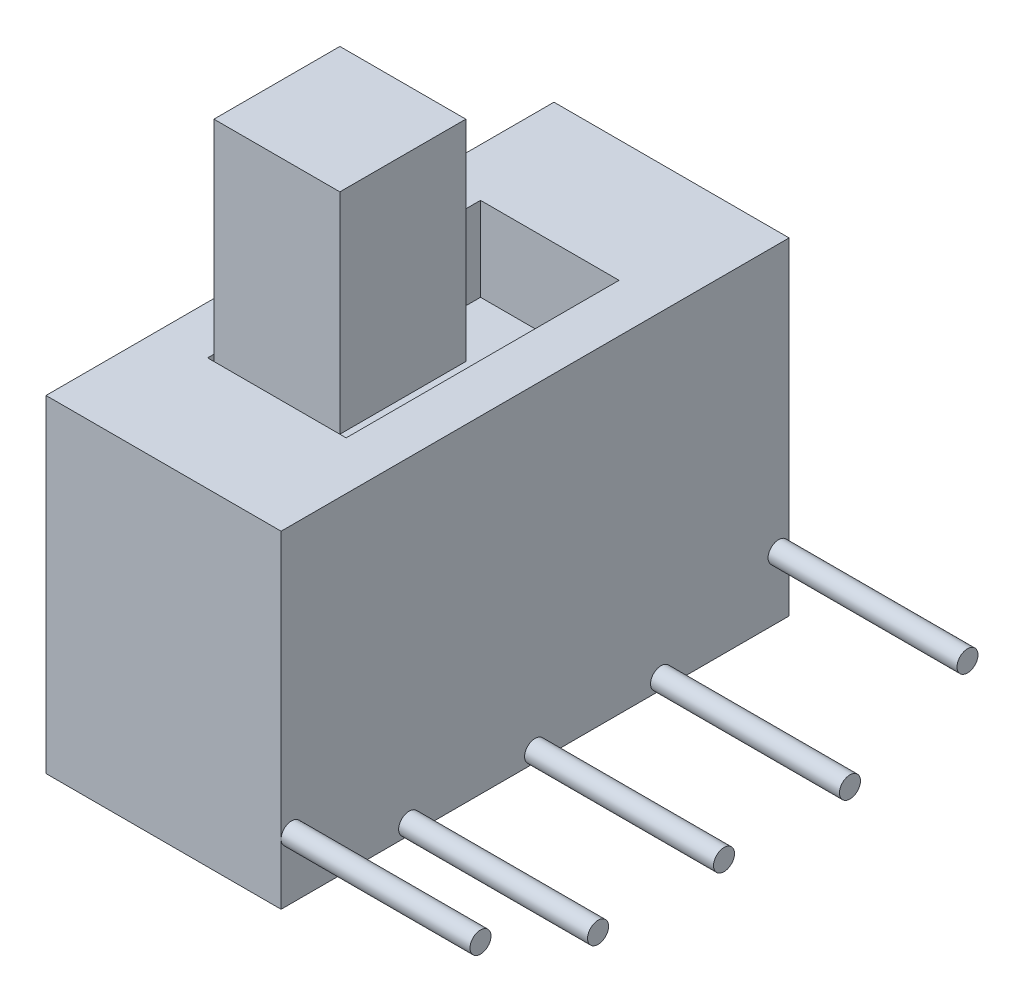
ISO-10303-21;
HEADER;
FILE_DESCRIPTION(('STEP AP214'),'2;1');
FILE_NAME('part.step','',(''),(''),'','','');
FILE_SCHEMA(('AUTOMOTIVE_DESIGN { 1 0 10303 214 1 1 1 1 }'));
ENDSEC;
DATA;
#1=APPLICATION_CONTEXT('core data for automotive mechanical design processes');
#2=APPLICATION_PROTOCOL_DEFINITION('international standard','automotive_design',2000,#1);
#3=PRODUCT_CONTEXT('',#1,'mechanical');
#4=PRODUCT('Part','Part','',(#3));
#5=PRODUCT_RELATED_PRODUCT_CATEGORY('part','',(#4));
#6=PRODUCT_DEFINITION_FORMATION('','',#4);
#7=PRODUCT_DEFINITION_CONTEXT('part definition',#1,'design');
#8=PRODUCT_DEFINITION('design','',#6,#7);
#9=PRODUCT_DEFINITION_SHAPE('','',#8);
#10=(LENGTH_UNIT() NAMED_UNIT(*) SI_UNIT(.MILLI.,.METRE.));
#11=(NAMED_UNIT(*) PLANE_ANGLE_UNIT() SI_UNIT($,.RADIAN.));
#12=(NAMED_UNIT(*) SI_UNIT($,.STERADIAN.) SOLID_ANGLE_UNIT());
#13=UNCERTAINTY_MEASURE_WITH_UNIT(LENGTH_MEASURE(1.E-05),#10,'distance_accuracy_value','');
#14=(GEOMETRIC_REPRESENTATION_CONTEXT(3) GLOBAL_UNCERTAINTY_ASSIGNED_CONTEXT((#13)) GLOBAL_UNIT_ASSIGNED_CONTEXT((#10,
#11,#12)) REPRESENTATION_CONTEXT('',''));
#15=CARTESIAN_POINT('',(0.,0.,0.));
#16=DIRECTION('',(0.,0.,1.));
#17=DIRECTION('',(1.,0.,0.));
#18=AXIS2_PLACEMENT_3D('',#15,#16,#17);
#19=CARTESIAN_POINT('',(2.80000000000001,7.8,-6.05000000000001));
#20=DIRECTION('',(-1.,0.,0.));
#21=DIRECTION('',(0.,0.,1.));
#22=AXIS2_PLACEMENT_3D('',#19,#20,#21);
#23=PLANE('',#22);
#24=DIRECTION('',(0.,-1.,0.));
#25=VECTOR('',#24,1.);
#26=CARTESIAN_POINT('',(2.80000000000001,7.8,6.04999999999999));
#27=LINE('',#26,#25);
#28=CARTESIAN_POINT('',(2.80000000000001,7.8,6.04999999999999));
#29=VERTEX_POINT('',#28);
#30=CARTESIAN_POINT('',(2.80000000000001,1.45,6.04999999999999));
#31=VERTEX_POINT('',#30);
#32=EDGE_CURVE('E298',#29,#31,#27,.T.);
#33=ORIENTED_EDGE('',*,*,#32,.T.);
#34=CARTESIAN_POINT('',(2.80000000000001,1.45,5.8));
#35=DIRECTION('',(1.,0.,0.));
#36=DIRECTION('',(0.,0.,1.));
#37=AXIS2_PLACEMENT_3D('',#34,#35,#36);
#38=CIRCLE('',#37,0.25);
#39=EDGE_CURVE('E193',#31,#31,#38,.T.);
#40=ORIENTED_EDGE('',*,*,#39,.F.);
#41=CARTESIAN_POINT('',(2.80000000000001,0.,6.04999999999999));
#42=VERTEX_POINT('',#41);
#43=EDGE_CURVE('E166',#31,#42,#27,.T.);
#44=ORIENTED_EDGE('',*,*,#43,.T.);
#45=DIRECTION('',(0.,0.,-1.));
#46=VECTOR('',#45,1.);
#47=CARTESIAN_POINT('',(2.80000000000001,0.,-6.05000000000001));
#48=LINE('',#47,#46);
#49=CARTESIAN_POINT('',(2.80000000000001,0.,3.));
#50=VERTEX_POINT('',#49);
#51=EDGE_CURVE('E160',#42,#50,#48,.T.);
#52=ORIENTED_EDGE('',*,*,#51,.T.);
#53=CARTESIAN_POINT('',(2.80000000000001,0.25,3.));
#54=DIRECTION('',(1.,0.,0.));
#55=DIRECTION('',(0.,0.,-1.));
#56=AXIS2_PLACEMENT_3D('',#53,#54,#55);
#57=CIRCLE('',#56,0.25);
#58=EDGE_CURVE('E174',#50,#50,#57,.T.);
#59=ORIENTED_EDGE('',*,*,#58,.F.);
#60=CARTESIAN_POINT('',(2.80000000000001,0.,0.));
#61=VERTEX_POINT('',#60);
#62=EDGE_CURVE('E165',#50,#61,#48,.T.);
#63=ORIENTED_EDGE('',*,*,#62,.T.);
#64=CARTESIAN_POINT('',(2.80000000000001,0.25,0.));
#65=DIRECTION('',(1.,0.,0.));
#66=DIRECTION('',(0.,0.,-1.));
#67=AXIS2_PLACEMENT_3D('',#64,#65,#66);
#68=CIRCLE('',#67,0.25);
#69=EDGE_CURVE('E173',#61,#61,#68,.T.);
#70=ORIENTED_EDGE('',*,*,#69,.F.);
#71=CARTESIAN_POINT('',(2.80000000000001,0.,-3.));
#72=VERTEX_POINT('',#71);
#73=EDGE_CURVE('E158',#61,#72,#48,.T.);
#74=ORIENTED_EDGE('',*,*,#73,.T.);
#75=CARTESIAN_POINT('',(2.80000000000001,0.25,-3.));
#76=DIRECTION('',(1.,0.,0.));
#77=DIRECTION('',(0.,0.,1.));
#78=AXIS2_PLACEMENT_3D('',#75,#76,#77);
#79=CIRCLE('',#78,0.25);
#80=EDGE_CURVE('E181',#72,#72,#79,.T.);
#81=ORIENTED_EDGE('',*,*,#80,.F.);
#82=CARTESIAN_POINT('',(2.80000000000001,0.,-6.05000000000001));
#83=VERTEX_POINT('',#82);
#84=EDGE_CURVE('E154',#72,#83,#48,.T.);
#85=ORIENTED_EDGE('',*,*,#84,.T.);
#86=DIRECTION('',(0.,-1.,0.));
#87=VECTOR('',#86,1.);
#88=CARTESIAN_POINT('',(2.80000000000001,7.8,-6.05000000000001));
#89=LINE('',#88,#87);
#90=CARTESIAN_POINT('',(2.80000000000001,1.45,-6.05000000000001));
#91=VERTEX_POINT('',#90);
#92=EDGE_CURVE('E177',#91,#83,#89,.T.);
#93=ORIENTED_EDGE('',*,*,#92,.F.);
#94=CARTESIAN_POINT('',(2.80000000000001,1.45,-5.8));
#95=DIRECTION('',(1.,0.,0.));
#96=DIRECTION('',(0.,0.,-1.));
#97=AXIS2_PLACEMENT_3D('',#94,#95,#96);
#98=CIRCLE('',#97,0.25);
#99=EDGE_CURVE('E187',#91,#91,#98,.T.);
#100=ORIENTED_EDGE('',*,*,#99,.F.);
#101=CARTESIAN_POINT('',(2.80000000000001,7.8,-6.05000000000001));
#102=VERTEX_POINT('',#101);
#103=EDGE_CURVE('E163',#102,#91,#89,.T.);
#104=ORIENTED_EDGE('',*,*,#103,.F.);
#105=DIRECTION('',(0.,0.,-1.));
#106=VECTOR('',#105,1.);
#107=CARTESIAN_POINT('',(2.80000000000001,7.8,-6.05000000000001));
#108=LINE('',#107,#106);
#109=EDGE_CURVE('E135',#29,#102,#108,.T.);
#110=ORIENTED_EDGE('',*,*,#109,.F.);
#111=EDGE_LOOP('',(#33,#40,#44,#52,#59,#63,#70,#74,#81,#85,#93,#100,#104,#110));
#112=FACE_BOUND('',#111,.T.);
#113=ADVANCED_FACE('F40',(#112),#23,.F.);
#114=CARTESIAN_POINT('',(-2.79999999999999,7.8,6.04999999999999));
#115=DIRECTION('',(0.,1.,0.));
#116=DIRECTION('',(0.,0.,1.));
#117=AXIS2_PLACEMENT_3D('',#114,#115,#116);
#118=PLANE('',#117);
#119=DIRECTION('',(0.,0.,-1.));
#120=VECTOR('',#119,1.);
#121=CARTESIAN_POINT('',(1.65,7.8,-3.15));
#122=LINE('',#121,#120);
#123=CARTESIAN_POINT('',(1.65,7.8,3.35));
#124=VERTEX_POINT('',#123);
#125=CARTESIAN_POINT('',(1.65,7.8,-3.15));
#126=VERTEX_POINT('',#125);
#127=EDGE_CURVE('E44',#124,#126,#122,.T.);
#128=ORIENTED_EDGE('',*,*,#127,.F.);
#129=DIRECTION('',(1.,0.,0.));
#130=VECTOR('',#129,1.);
#131=CARTESIAN_POINT('',(1.65,7.8,3.35));
#132=LINE('',#131,#130);
#133=CARTESIAN_POINT('',(-1.65,7.8,3.35));
#134=VERTEX_POINT('',#133);
#135=EDGE_CURVE('E207',#134,#124,#132,.T.);
#136=ORIENTED_EDGE('',*,*,#135,.F.);
#137=DIRECTION('',(0.,0.,1.));
#138=VECTOR('',#137,1.);
#139=CARTESIAN_POINT('',(-1.65,7.8,-3.15));
#140=LINE('',#139,#138);
#141=CARTESIAN_POINT('',(-1.65,7.8,-3.15));
#142=VERTEX_POINT('',#141);
#143=EDGE_CURVE('E205',#142,#134,#140,.T.);
#144=ORIENTED_EDGE('',*,*,#143,.F.);
#145=DIRECTION('',(-1.,0.,0.));
#146=VECTOR('',#145,1.);
#147=CARTESIAN_POINT('',(1.65,7.8,-3.15));
#148=LINE('',#147,#146);
#149=EDGE_CURVE('E203',#126,#142,#148,.T.);
#150=ORIENTED_EDGE('',*,*,#149,.F.);
#151=EDGE_LOOP('',(#128,#136,#144,#150));
#152=FACE_BOUND('',#151,.T.);
#153=DIRECTION('',(0.,0.,1.));
#154=VECTOR('',#153,1.);
#155=CARTESIAN_POINT('',(-2.79999999999999,7.8,-6.05000000000001));
#156=LINE('',#155,#154);
#157=CARTESIAN_POINT('',(-2.79999999999999,7.8,-6.05000000000001));
#158=VERTEX_POINT('',#157);
#159=CARTESIAN_POINT('',(-2.79999999999999,7.8,6.04999999999999));
#160=VERTEX_POINT('',#159);
#161=EDGE_CURVE('E132',#158,#160,#156,.T.);
#162=ORIENTED_EDGE('',*,*,#161,.T.);
#163=DIRECTION('',(1.,0.,0.));
#164=VECTOR('',#163,1.);
#165=CARTESIAN_POINT('',(-2.79999999999999,7.8,6.04999999999999));
#166=LINE('',#165,#164);
#167=EDGE_CURVE('E153',#160,#29,#166,.T.);
#168=ORIENTED_EDGE('',*,*,#167,.T.);
#169=ORIENTED_EDGE('',*,*,#109,.T.);
#170=DIRECTION('',(-1.,0.,0.));
#171=VECTOR('',#170,1.);
#172=CARTESIAN_POINT('',(-2.79999999999999,7.8,-6.05000000000001));
#173=LINE('',#172,#171);
#174=EDGE_CURVE('E128',#102,#158,#173,.T.);
#175=ORIENTED_EDGE('',*,*,#174,.T.);
#176=EDGE_LOOP('',(#162,#168,#169,#175));
#177=FACE_BOUND('',#176,.T.);
#178=ADVANCED_FACE('F130',(#152,#177),#118,.T.);
#179=CARTESIAN_POINT('',(-2.79999999999999,7.8,-6.05000000000001));
#180=DIRECTION('',(1.,0.,0.));
#181=DIRECTION('',(0.,0.,-1.));
#182=AXIS2_PLACEMENT_3D('',#179,#180,#181);
#183=PLANE('',#182);
#184=DIRECTION('',(0.,0.,1.));
#185=VECTOR('',#184,1.);
#186=CARTESIAN_POINT('',(-2.79999999999999,0.,-6.05000000000001));
#187=LINE('',#186,#185);
#188=CARTESIAN_POINT('',(-2.79999999999999,0.,-6.05000000000001));
#189=VERTEX_POINT('',#188);
#190=CARTESIAN_POINT('',(-2.79999999999999,0.,6.04999999999999));
#191=VERTEX_POINT('',#190);
#192=EDGE_CURVE('E138',#189,#191,#187,.T.);
#193=ORIENTED_EDGE('',*,*,#192,.T.);
#194=DIRECTION('',(0.,-1.,0.));
#195=VECTOR('',#194,1.);
#196=CARTESIAN_POINT('',(-2.79999999999999,7.8,6.04999999999999));
#197=LINE('',#196,#195);
#198=EDGE_CURVE('E152',#160,#191,#197,.T.);
#199=ORIENTED_EDGE('',*,*,#198,.F.);
#200=ORIENTED_EDGE('',*,*,#161,.F.);
#201=DIRECTION('',(0.,-1.,0.));
#202=VECTOR('',#201,1.);
#203=CARTESIAN_POINT('',(-2.79999999999999,7.8,-6.05000000000001));
#204=LINE('',#203,#202);
#205=EDGE_CURVE('E141',#158,#189,#204,.T.);
#206=ORIENTED_EDGE('',*,*,#205,.T.);
#207=EDGE_LOOP('',(#193,#199,#200,#206));
#208=FACE_BOUND('',#207,.T.);
#209=ADVANCED_FACE('F150',(#208),#183,.F.);
#210=CARTESIAN_POINT('',(-2.79999999999999,7.8,6.04999999999999));
#211=DIRECTION('',(0.,0.,-1.));
#212=DIRECTION('',(-1.,0.,0.));
#213=AXIS2_PLACEMENT_3D('',#210,#211,#212);
#214=PLANE('',#213);
#215=DIRECTION('',(1.,0.,0.));
#216=VECTOR('',#215,1.);
#217=CARTESIAN_POINT('',(-2.79999999999999,0.,6.04999999999999));
#218=LINE('',#217,#216);
#219=EDGE_CURVE('E148',#191,#42,#218,.T.);
#220=ORIENTED_EDGE('',*,*,#219,.T.);
#221=ORIENTED_EDGE('',*,*,#43,.F.);
#222=ORIENTED_EDGE('',*,*,#32,.F.);
#223=ORIENTED_EDGE('',*,*,#167,.F.);
#224=ORIENTED_EDGE('',*,*,#198,.T.);
#225=EDGE_LOOP('',(#220,#221,#222,#223,#224));
#226=FACE_BOUND('',#225,.T.);
#227=ADVANCED_FACE('F249',(#226),#214,.F.);
#228=CARTESIAN_POINT('',(-2.79999999999999,7.8,-6.05000000000001));
#229=DIRECTION('',(0.,0.,1.));
#230=DIRECTION('',(1.,0.,0.));
#231=AXIS2_PLACEMENT_3D('',#228,#229,#230);
#232=PLANE('',#231);
#233=DIRECTION('',(-1.,0.,0.));
#234=VECTOR('',#233,1.);
#235=CARTESIAN_POINT('',(-2.79999999999999,0.,-6.05000000000001));
#236=LINE('',#235,#234);
#237=EDGE_CURVE('E144',#83,#189,#236,.T.);
#238=ORIENTED_EDGE('',*,*,#237,.T.);
#239=ORIENTED_EDGE('',*,*,#205,.F.);
#240=ORIENTED_EDGE('',*,*,#174,.F.);
#241=ORIENTED_EDGE('',*,*,#103,.T.);
#242=ORIENTED_EDGE('',*,*,#92,.T.);
#243=EDGE_LOOP('',(#238,#239,#240,#241,#242));
#244=FACE_BOUND('',#243,.T.);
#245=ADVANCED_FACE('F142',(#244),#232,.F.);
#246=CARTESIAN_POINT('',(-2.79999999999999,0.,6.04999999999999));
#247=DIRECTION('',(0.,1.,0.));
#248=DIRECTION('',(0.,0.,1.));
#249=AXIS2_PLACEMENT_3D('',#246,#247,#248);
#250=PLANE('',#249);
#251=ORIENTED_EDGE('',*,*,#192,.F.);
#252=ORIENTED_EDGE('',*,*,#237,.F.);
#253=ORIENTED_EDGE('',*,*,#84,.F.);
#254=ORIENTED_EDGE('',*,*,#73,.F.);
#255=ORIENTED_EDGE('',*,*,#62,.F.);
#256=ORIENTED_EDGE('',*,*,#51,.F.);
#257=ORIENTED_EDGE('',*,*,#219,.F.);
#258=EDGE_LOOP('',(#251,#252,#253,#254,#255,#256,#257));
#259=FACE_BOUND('',#258,.T.);
#260=ADVANCED_FACE('F252',(#259),#250,.F.);
#261=CARTESIAN_POINT('',(7.30000000000001,0.25,3.));
#262=DIRECTION('',(-1.,0.,0.));
#263=DIRECTION('',(0.,0.,1.));
#264=AXIS2_PLACEMENT_3D('',#261,#262,#263);
#265=CYLINDRICAL_SURFACE('',#264,0.25);
#266=CARTESIAN_POINT('',(7.30000000000001,0.25,3.));
#267=DIRECTION('',(1.,0.,0.));
#268=DIRECTION('',(0.,0.,-1.));
#269=AXIS2_PLACEMENT_3D('',#266,#267,#268);
#270=CIRCLE('',#269,0.25);
#271=CARTESIAN_POINT('',(7.30000000000001,0.25,2.75));
#272=VERTEX_POINT('',#271);
#273=EDGE_CURVE('E170',#272,#272,#270,.T.);
#274=ORIENTED_EDGE('',*,*,#273,.F.);
#275=EDGE_LOOP('',(#274));
#276=FACE_BOUND('',#275,.T.);
#277=ORIENTED_EDGE('',*,*,#58,.T.);
#278=EDGE_LOOP('',(#277));
#279=FACE_BOUND('',#278,.T.);
#280=ADVANCED_FACE('F256',(#276,#279),#265,.T.);
#281=CARTESIAN_POINT('',(7.30000000000001,0.25,3.));
#282=DIRECTION('',(1.,0.,0.));
#283=DIRECTION('',(0.,0.,-1.));
#284=AXIS2_PLACEMENT_3D('',#281,#282,#283);
#285=PLANE('',#284);
#286=ORIENTED_EDGE('',*,*,#273,.T.);
#287=EDGE_LOOP('',(#286));
#288=FACE_BOUND('',#287,.T.);
#289=ADVANCED_FACE('F260',(#288),#285,.T.);
#290=CARTESIAN_POINT('',(7.30000000000001,0.25,0.));
#291=DIRECTION('',(-1.,0.,0.));
#292=DIRECTION('',(0.,0.,1.));
#293=AXIS2_PLACEMENT_3D('',#290,#291,#292);
#294=CYLINDRICAL_SURFACE('',#293,0.25);
#295=CARTESIAN_POINT('',(7.30000000000001,0.25,0.));
#296=DIRECTION('',(1.,0.,0.));
#297=DIRECTION('',(0.,0.,-1.));
#298=AXIS2_PLACEMENT_3D('',#295,#296,#297);
#299=CIRCLE('',#298,0.25);
#300=CARTESIAN_POINT('',(7.30000000000001,0.25,-0.250000000000003));
#301=VERTEX_POINT('',#300);
#302=EDGE_CURVE('E178',#301,#301,#299,.T.);
#303=ORIENTED_EDGE('',*,*,#302,.F.);
#304=EDGE_LOOP('',(#303));
#305=FACE_BOUND('',#304,.T.);
#306=ORIENTED_EDGE('',*,*,#69,.T.);
#307=EDGE_LOOP('',(#306));
#308=FACE_BOUND('',#307,.T.);
#309=ADVANCED_FACE('F264',(#305,#308),#294,.T.);
#310=CARTESIAN_POINT('',(7.30000000000001,0.25,0.));
#311=DIRECTION('',(1.,0.,0.));
#312=DIRECTION('',(0.,0.,-1.));
#313=AXIS2_PLACEMENT_3D('',#310,#311,#312);
#314=PLANE('',#313);
#315=ORIENTED_EDGE('',*,*,#302,.T.);
#316=EDGE_LOOP('',(#315));
#317=FACE_BOUND('',#316,.T.);
#318=ADVANCED_FACE('F268',(#317),#314,.T.);
#319=CARTESIAN_POINT('',(7.30000000000001,0.25,-3.));
#320=DIRECTION('',(-1.,0.,0.));
#321=DIRECTION('',(0.,0.,1.));
#322=AXIS2_PLACEMENT_3D('',#319,#320,#321);
#323=CYLINDRICAL_SURFACE('',#322,0.25);
#324=CARTESIAN_POINT('',(7.30000000000001,0.25,-3.));
#325=DIRECTION('',(1.,0.,0.));
#326=DIRECTION('',(0.,0.,1.));
#327=AXIS2_PLACEMENT_3D('',#324,#325,#326);
#328=CIRCLE('',#327,0.25);
#329=CARTESIAN_POINT('',(7.30000000000001,0.25,-2.75));
#330=VERTEX_POINT('',#329);
#331=EDGE_CURVE('E184',#330,#330,#328,.T.);
#332=ORIENTED_EDGE('',*,*,#331,.F.);
#333=EDGE_LOOP('',(#332));
#334=FACE_BOUND('',#333,.T.);
#335=ORIENTED_EDGE('',*,*,#80,.T.);
#336=EDGE_LOOP('',(#335));
#337=FACE_BOUND('',#336,.T.);
#338=ADVANCED_FACE('F272',(#334,#337),#323,.T.);
#339=CARTESIAN_POINT('',(7.30000000000001,0.25,-3.));
#340=DIRECTION('',(-1.,0.,0.));
#341=DIRECTION('',(0.,0.,1.));
#342=AXIS2_PLACEMENT_3D('',#339,#340,#341);
#343=PLANE('',#342);
#344=ORIENTED_EDGE('',*,*,#331,.T.);
#345=EDGE_LOOP('',(#344));
#346=FACE_BOUND('',#345,.T.);
#347=ADVANCED_FACE('F276',(#346),#343,.F.);
#348=CARTESIAN_POINT('',(7.30000000000001,1.45,-5.8));
#349=DIRECTION('',(-1.,0.,0.));
#350=DIRECTION('',(0.,0.,1.));
#351=AXIS2_PLACEMENT_3D('',#348,#349,#350);
#352=CYLINDRICAL_SURFACE('',#351,0.25);
#353=CARTESIAN_POINT('',(7.30000000000001,1.45,-5.8));
#354=DIRECTION('',(1.,0.,0.));
#355=DIRECTION('',(0.,0.,-1.));
#356=AXIS2_PLACEMENT_3D('',#353,#354,#355);
#357=CIRCLE('',#356,0.25);
#358=CARTESIAN_POINT('',(7.30000000000001,1.45,-6.05));
#359=VERTEX_POINT('',#358);
#360=EDGE_CURVE('E190',#359,#359,#357,.T.);
#361=ORIENTED_EDGE('',*,*,#360,.F.);
#362=EDGE_LOOP('',(#361));
#363=FACE_BOUND('',#362,.T.);
#364=ORIENTED_EDGE('',*,*,#99,.T.);
#365=EDGE_LOOP('',(#364));
#366=FACE_BOUND('',#365,.T.);
#367=ADVANCED_FACE('F280',(#363,#366),#352,.T.);
#368=CARTESIAN_POINT('',(7.30000000000001,1.45,-5.8));
#369=DIRECTION('',(1.,0.,0.));
#370=DIRECTION('',(0.,0.,-1.));
#371=AXIS2_PLACEMENT_3D('',#368,#369,#370);
#372=PLANE('',#371);
#373=ORIENTED_EDGE('',*,*,#360,.T.);
#374=EDGE_LOOP('',(#373));
#375=FACE_BOUND('',#374,.T.);
#376=ADVANCED_FACE('F284',(#375),#372,.T.);
#377=CARTESIAN_POINT('',(7.30000000000001,1.45,5.8));
#378=DIRECTION('',(-1.,0.,0.));
#379=DIRECTION('',(0.,0.,1.));
#380=AXIS2_PLACEMENT_3D('',#377,#378,#379);
#381=CYLINDRICAL_SURFACE('',#380,0.25);
#382=CARTESIAN_POINT('',(7.30000000000001,1.45,5.8));
#383=DIRECTION('',(1.,0.,0.));
#384=DIRECTION('',(0.,0.,1.));
#385=AXIS2_PLACEMENT_3D('',#382,#383,#384);
#386=CIRCLE('',#385,0.25);
#387=CARTESIAN_POINT('',(7.30000000000001,1.45,6.05));
#388=VERTEX_POINT('',#387);
#389=EDGE_CURVE('E196',#388,#388,#386,.T.);
#390=ORIENTED_EDGE('',*,*,#389,.F.);
#391=EDGE_LOOP('',(#390));
#392=FACE_BOUND('',#391,.T.);
#393=ORIENTED_EDGE('',*,*,#39,.T.);
#394=EDGE_LOOP('',(#393));
#395=FACE_BOUND('',#394,.T.);
#396=ADVANCED_FACE('F236',(#392,#395),#381,.T.);
#397=CARTESIAN_POINT('',(7.30000000000001,1.45,5.8));
#398=DIRECTION('',(-1.,0.,0.));
#399=DIRECTION('',(0.,0.,1.));
#400=AXIS2_PLACEMENT_3D('',#397,#398,#399);
#401=PLANE('',#400);
#402=ORIENTED_EDGE('',*,*,#389,.T.);
#403=EDGE_LOOP('',(#402));
#404=FACE_BOUND('',#403,.T.);
#405=ADVANCED_FACE('F230',(#404),#401,.F.);
#406=CARTESIAN_POINT('',(1.65,5.8,-3.15));
#407=DIRECTION('',(1.,0.,0.));
#408=DIRECTION('',(0.,0.,-1.));
#409=AXIS2_PLACEMENT_3D('',#406,#407,#408);
#410=PLANE('',#409);
#411=ORIENTED_EDGE('',*,*,#127,.T.);
#412=DIRECTION('',(0.,1.,0.));
#413=VECTOR('',#412,1.);
#414=CARTESIAN_POINT('',(1.65,5.8,-3.15));
#415=LINE('',#414,#413);
#416=CARTESIAN_POINT('',(1.65,5.8,-3.15));
#417=VERTEX_POINT('',#416);
#418=EDGE_CURVE('E57',#417,#126,#415,.T.);
#419=ORIENTED_EDGE('',*,*,#418,.F.);
#420=DIRECTION('',(0.,0.,-1.));
#421=VECTOR('',#420,1.);
#422=CARTESIAN_POINT('',(1.65,5.8,-3.15));
#423=LINE('',#422,#421);
#424=CARTESIAN_POINT('',(1.65,5.8,3.35));
#425=VERTEX_POINT('',#424);
#426=EDGE_CURVE('E202',#425,#417,#423,.T.);
#427=ORIENTED_EDGE('',*,*,#426,.F.);
#428=DIRECTION('',(0.,1.,0.));
#429=VECTOR('',#428,1.);
#430=CARTESIAN_POINT('',(1.65,5.8,3.35));
#431=LINE('',#430,#429);
#432=EDGE_CURVE('E85',#425,#124,#431,.T.);
#433=ORIENTED_EDGE('',*,*,#432,.T.);
#434=EDGE_LOOP('',(#411,#419,#427,#433));
#435=FACE_BOUND('',#434,.T.);
#436=ADVANCED_FACE('F227',(#435),#410,.F.);
#437=CARTESIAN_POINT('',(1.65,5.8,3.35));
#438=DIRECTION('',(0.,0.,1.));
#439=DIRECTION('',(1.,0.,0.));
#440=AXIS2_PLACEMENT_3D('',#437,#438,#439);
#441=PLANE('',#440);
#442=ORIENTED_EDGE('',*,*,#135,.T.);
#443=ORIENTED_EDGE('',*,*,#432,.F.);
#444=DIRECTION('',(1.,0.,0.));
#445=VECTOR('',#444,1.);
#446=CARTESIAN_POINT('',(1.65,5.8,3.35));
#447=LINE('',#446,#445);
#448=CARTESIAN_POINT('',(-1.65,5.8,3.35));
#449=VERTEX_POINT('',#448);
#450=EDGE_CURVE('E12',#449,#425,#447,.T.);
#451=ORIENTED_EDGE('',*,*,#450,.F.);
#452=DIRECTION('',(0.,1.,0.));
#453=VECTOR('',#452,1.);
#454=CARTESIAN_POINT('',(-1.65,5.8,3.35));
#455=LINE('',#454,#453);
#456=EDGE_CURVE('E81',#449,#134,#455,.T.);
#457=ORIENTED_EDGE('',*,*,#456,.T.);
#458=EDGE_LOOP('',(#442,#443,#451,#457));
#459=FACE_BOUND('',#458,.T.);
#460=ADVANCED_FACE('F229',(#459),#441,.F.);
#461=CARTESIAN_POINT('',(-1.65,5.8,-3.15));
#462=DIRECTION('',(-1.,0.,0.));
#463=DIRECTION('',(0.,0.,1.));
#464=AXIS2_PLACEMENT_3D('',#461,#462,#463);
#465=PLANE('',#464);
#466=ORIENTED_EDGE('',*,*,#143,.T.);
#467=ORIENTED_EDGE('',*,*,#456,.F.);
#468=DIRECTION('',(0.,0.,1.));
#469=VECTOR('',#468,1.);
#470=CARTESIAN_POINT('',(-1.65,5.8,-3.15));
#471=LINE('',#470,#469);
#472=CARTESIAN_POINT('',(-1.65,5.8,-3.15));
#473=VERTEX_POINT('',#472);
#474=EDGE_CURVE('E49',#473,#449,#471,.T.);
#475=ORIENTED_EDGE('',*,*,#474,.F.);
#476=DIRECTION('',(0.,1.,0.));
#477=VECTOR('',#476,1.);
#478=CARTESIAN_POINT('',(-1.65,5.8,-3.15));
#479=LINE('',#478,#477);
#480=EDGE_CURVE('E63',#473,#142,#479,.T.);
#481=ORIENTED_EDGE('',*,*,#480,.T.);
#482=EDGE_LOOP('',(#466,#467,#475,#481));
#483=FACE_BOUND('',#482,.T.);
#484=ADVANCED_FACE('F224',(#483),#465,.F.);
#485=CARTESIAN_POINT('',(1.65,5.8,-3.15));
#486=DIRECTION('',(0.,0.,-1.));
#487=DIRECTION('',(-1.,0.,0.));
#488=AXIS2_PLACEMENT_3D('',#485,#486,#487);
#489=PLANE('',#488);
#490=ORIENTED_EDGE('',*,*,#149,.T.);
#491=ORIENTED_EDGE('',*,*,#480,.F.);
#492=DIRECTION('',(-1.,0.,0.));
#493=VECTOR('',#492,1.);
#494=CARTESIAN_POINT('',(1.65,5.8,-3.15));
#495=LINE('',#494,#493);
#496=EDGE_CURVE('E211',#417,#473,#495,.T.);
#497=ORIENTED_EDGE('',*,*,#496,.F.);
#498=ORIENTED_EDGE('',*,*,#418,.T.);
#499=EDGE_LOOP('',(#490,#491,#497,#498));
#500=FACE_BOUND('',#499,.T.);
#501=ADVANCED_FACE('F219',(#500),#489,.F.);
#502=CARTESIAN_POINT('',(1.65,5.8,3.35));
#503=DIRECTION('',(0.,-1.,0.));
#504=DIRECTION('',(0.,0.,-1.));
#505=AXIS2_PLACEMENT_3D('',#502,#503,#504);
#506=PLANE('',#505);
#507=ORIENTED_EDGE('',*,*,#426,.T.);
#508=ORIENTED_EDGE('',*,*,#496,.T.);
#509=ORIENTED_EDGE('',*,*,#474,.T.);
#510=ORIENTED_EDGE('',*,*,#450,.T.);
#511=EDGE_LOOP('',(#507,#508,#509,#510));
#512=FACE_BOUND('',#511,.T.);
#513=ADVANCED_FACE('F42',(#512),#506,.F.);
#514=CLOSED_SHELL('',(#113,#178,#209,#227,#245,#260,#280,#289,#309,#318,#338,#347,#367,#376,
#396,#405,#436,#460,#484,#501,#513));
#515=MANIFOLD_SOLID_BREP('B2',#514);
#516=CARTESIAN_POINT('',(1.5,12.8,3.35));
#517=DIRECTION('',(0.,-1.,0.));
#518=DIRECTION('',(0.,0.,-1.));
#519=AXIS2_PLACEMENT_3D('',#516,#517,#518);
#520=PLANE('',#519);
#521=DIRECTION('',(0.,0.,-1.));
#522=VECTOR('',#521,1.);
#523=CARTESIAN_POINT('',(1.5,12.8,0.35));
#524=LINE('',#523,#522);
#525=CARTESIAN_POINT('',(1.5,12.8,3.35));
#526=VERTEX_POINT('',#525);
#527=CARTESIAN_POINT('',(1.5,12.8,0.35));
#528=VERTEX_POINT('',#527);
#529=EDGE_CURVE('E453',#526,#528,#524,.T.);
#530=ORIENTED_EDGE('',*,*,#529,.T.);
#531=DIRECTION('',(-1.,0.,0.));
#532=VECTOR('',#531,1.);
#533=CARTESIAN_POINT('',(1.5,12.8,0.35));
#534=LINE('',#533,#532);
#535=CARTESIAN_POINT('',(-1.5,12.8,0.35));
#536=VERTEX_POINT('',#535);
#537=EDGE_CURVE('E474',#528,#536,#534,.T.);
#538=ORIENTED_EDGE('',*,*,#537,.T.);
#539=DIRECTION('',(0.,0.,1.));
#540=VECTOR('',#539,1.);
#541=CARTESIAN_POINT('',(-1.5,12.8,0.35));
#542=LINE('',#541,#540);
#543=CARTESIAN_POINT('',(-1.5,12.8,3.35));
#544=VERTEX_POINT('',#543);
#545=EDGE_CURVE('E465',#536,#544,#542,.T.);
#546=ORIENTED_EDGE('',*,*,#545,.T.);
#547=DIRECTION('',(1.,0.,0.));
#548=VECTOR('',#547,1.);
#549=CARTESIAN_POINT('',(1.5,12.8,3.35));
#550=LINE('',#549,#548);
#551=EDGE_CURVE('E428',#544,#526,#550,.T.);
#552=ORIENTED_EDGE('',*,*,#551,.T.);
#553=EDGE_LOOP('',(#530,#538,#546,#552));
#554=FACE_BOUND('',#553,.T.);
#555=ADVANCED_FACE('F406',(#554),#520,.F.);
#556=CARTESIAN_POINT('',(1.5,12.8,3.35));
#557=DIRECTION('',(0.,0.,-1.));
#558=DIRECTION('',(-1.,0.,0.));
#559=AXIS2_PLACEMENT_3D('',#556,#557,#558);
#560=PLANE('',#559);
#561=DIRECTION('',(1.,0.,0.));
#562=VECTOR('',#561,1.);
#563=CARTESIAN_POINT('',(1.5,7.8,3.35));
#564=LINE('',#563,#562);
#565=CARTESIAN_POINT('',(-1.5,7.8,3.35));
#566=VERTEX_POINT('',#565);
#567=CARTESIAN_POINT('',(1.5,7.8,3.35));
#568=VERTEX_POINT('',#567);
#569=EDGE_CURVE('E38',#566,#568,#564,.T.);
#570=ORIENTED_EDGE('',*,*,#569,.T.);
#571=DIRECTION('',(0.,-1.,0.));
#572=VECTOR('',#571,1.);
#573=CARTESIAN_POINT('',(1.5,12.8,3.35));
#574=LINE('',#573,#572);
#575=EDGE_CURVE('E467',#526,#568,#574,.T.);
#576=ORIENTED_EDGE('',*,*,#575,.F.);
#577=ORIENTED_EDGE('',*,*,#551,.F.);
#578=DIRECTION('',(0.,-1.,0.));
#579=VECTOR('',#578,1.);
#580=CARTESIAN_POINT('',(-1.5,12.8,3.35));
#581=LINE('',#580,#579);
#582=EDGE_CURVE('E466',#544,#566,#581,.T.);
#583=ORIENTED_EDGE('',*,*,#582,.T.);
#584=EDGE_LOOP('',(#570,#576,#577,#583));
#585=FACE_BOUND('',#584,.T.);
#586=ADVANCED_FACE('F480',(#585),#560,.F.);
#587=CARTESIAN_POINT('',(-1.5,12.8,0.35));
#588=DIRECTION('',(1.,0.,0.));
#589=DIRECTION('',(0.,0.,-1.));
#590=AXIS2_PLACEMENT_3D('',#587,#588,#589);
#591=PLANE('',#590);
#592=DIRECTION('',(0.,0.,1.));
#593=VECTOR('',#592,1.);
#594=CARTESIAN_POINT('',(-1.5,7.8,0.35));
#595=LINE('',#594,#593);
#596=CARTESIAN_POINT('',(-1.5,7.8,0.35));
#597=VERTEX_POINT('',#596);
#598=EDGE_CURVE('E445',#597,#566,#595,.T.);
#599=ORIENTED_EDGE('',*,*,#598,.T.);
#600=ORIENTED_EDGE('',*,*,#582,.F.);
#601=ORIENTED_EDGE('',*,*,#545,.F.);
#602=DIRECTION('',(0.,-1.,0.));
#603=VECTOR('',#602,1.);
#604=CARTESIAN_POINT('',(-1.5,12.8,0.35));
#605=LINE('',#604,#603);
#606=EDGE_CURVE('E458',#536,#597,#605,.T.);
#607=ORIENTED_EDGE('',*,*,#606,.T.);
#608=EDGE_LOOP('',(#599,#600,#601,#607));
#609=FACE_BOUND('',#608,.T.);
#610=ADVANCED_FACE('F464',(#609),#591,.F.);
#611=CARTESIAN_POINT('',(1.5,12.8,0.35));
#612=DIRECTION('',(0.,0.,1.));
#613=DIRECTION('',(1.,0.,0.));
#614=AXIS2_PLACEMENT_3D('',#611,#612,#613);
#615=PLANE('',#614);
#616=DIRECTION('',(-1.,0.,0.));
#617=VECTOR('',#616,1.);
#618=CARTESIAN_POINT('',(1.5,7.8,0.35));
#619=LINE('',#618,#617);
#620=CARTESIAN_POINT('',(1.5,7.8,0.35));
#621=VERTEX_POINT('',#620);
#622=EDGE_CURVE('E448',#621,#597,#619,.T.);
#623=ORIENTED_EDGE('',*,*,#622,.T.);
#624=ORIENTED_EDGE('',*,*,#606,.F.);
#625=ORIENTED_EDGE('',*,*,#537,.F.);
#626=DIRECTION('',(0.,-1.,0.));
#627=VECTOR('',#626,1.);
#628=CARTESIAN_POINT('',(1.5,12.8,0.35));
#629=LINE('',#628,#627);
#630=EDGE_CURVE('E410',#528,#621,#629,.T.);
#631=ORIENTED_EDGE('',*,*,#630,.T.);
#632=EDGE_LOOP('',(#623,#624,#625,#631));
#633=FACE_BOUND('',#632,.T.);
#634=ADVANCED_FACE('F457',(#633),#615,.F.);
#635=CARTESIAN_POINT('',(1.5,12.8,0.35));
#636=DIRECTION('',(-1.,0.,0.));
#637=DIRECTION('',(0.,0.,1.));
#638=AXIS2_PLACEMENT_3D('',#635,#636,#637);
#639=PLANE('',#638);
#640=DIRECTION('',(0.,0.,-1.));
#641=VECTOR('',#640,1.);
#642=CARTESIAN_POINT('',(1.5,7.8,0.35));
#643=LINE('',#642,#641);
#644=EDGE_CURVE('E462',#568,#621,#643,.T.);
#645=ORIENTED_EDGE('',*,*,#644,.T.);
#646=ORIENTED_EDGE('',*,*,#630,.F.);
#647=ORIENTED_EDGE('',*,*,#529,.F.);
#648=ORIENTED_EDGE('',*,*,#575,.T.);
#649=EDGE_LOOP('',(#645,#646,#647,#648));
#650=FACE_BOUND('',#649,.T.);
#651=ADVANCED_FACE('F408',(#650),#639,.F.);
#652=CARTESIAN_POINT('',(1.65,7.8,3.35));
#653=DIRECTION('',(0.,-1.,0.));
#654=DIRECTION('',(0.,0.,-1.));
#655=AXIS2_PLACEMENT_3D('',#652,#653,#654);
#656=PLANE('',#655);
#657=ORIENTED_EDGE('',*,*,#644,.F.);
#658=ORIENTED_EDGE('',*,*,#569,.F.);
#659=ORIENTED_EDGE('',*,*,#598,.F.);
#660=ORIENTED_EDGE('',*,*,#622,.F.);
#661=EDGE_LOOP('',(#657,#658,#659,#660));
#662=FACE_BOUND('',#661,.T.);
#663=ADVANCED_FACE('F447',(#662),#656,.T.);
#664=CLOSED_SHELL('',(#555,#586,#610,#634,#651,#663));
#665=MANIFOLD_SOLID_BREP('B6',#664);
#666=ADVANCED_BREP_SHAPE_REPRESENTATION('',(#18,#515,#665),#14);
#667=SHAPE_DEFINITION_REPRESENTATION(#9,#666);
ENDSEC;
END-ISO-10303-21;
